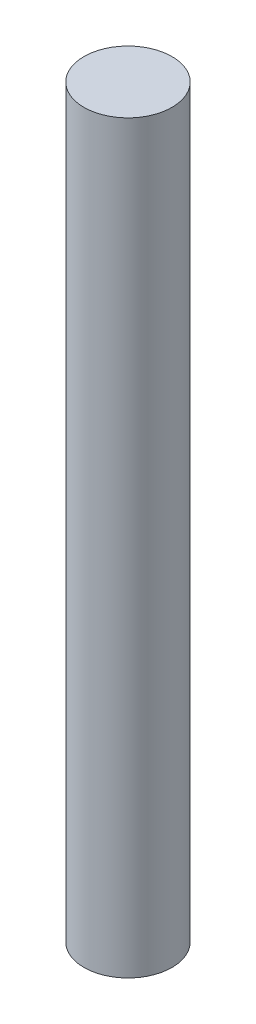
ISO-10303-21;
HEADER;
FILE_DESCRIPTION(('STEP AP214'),'2;1');
FILE_NAME('part.step','',(''),(''),'','','');
FILE_SCHEMA(('AUTOMOTIVE_DESIGN { 1 0 10303 214 1 1 1 1 }'));
ENDSEC;
DATA;
#1=APPLICATION_CONTEXT('core data for automotive mechanical design processes');
#2=APPLICATION_PROTOCOL_DEFINITION('international standard','automotive_design',2000,#1);
#3=PRODUCT_CONTEXT('',#1,'mechanical');
#4=PRODUCT('Part','Part','',(#3));
#5=PRODUCT_RELATED_PRODUCT_CATEGORY('part','',(#4));
#6=PRODUCT_DEFINITION_FORMATION('','',#4);
#7=PRODUCT_DEFINITION_CONTEXT('part definition',#1,'design');
#8=PRODUCT_DEFINITION('design','',#6,#7);
#9=PRODUCT_DEFINITION_SHAPE('','',#8);
#10=(LENGTH_UNIT() NAMED_UNIT(*) SI_UNIT(.MILLI.,.METRE.));
#11=(NAMED_UNIT(*) PLANE_ANGLE_UNIT() SI_UNIT($,.RADIAN.));
#12=(NAMED_UNIT(*) SI_UNIT($,.STERADIAN.) SOLID_ANGLE_UNIT());
#13=UNCERTAINTY_MEASURE_WITH_UNIT(LENGTH_MEASURE(1.E-05),#10,'distance_accuracy_value','');
#14=(GEOMETRIC_REPRESENTATION_CONTEXT(3) GLOBAL_UNCERTAINTY_ASSIGNED_CONTEXT((#13)) GLOBAL_UNIT_ASSIGNED_CONTEXT((#10,
#11,#12)) REPRESENTATION_CONTEXT('',''));
#15=CARTESIAN_POINT('',(0.,0.,0.));
#16=DIRECTION('',(0.,0.,1.));
#17=DIRECTION('',(1.,0.,0.));
#18=AXIS2_PLACEMENT_3D('',#15,#16,#17);
#19=CARTESIAN_POINT('',(-32.274944086,-23.599553766,-96.577253632));
#20=DIRECTION('',(0.,-1.,0.));
#21=DIRECTION('',(1.,0.,0.));
#22=AXIS2_PLACEMENT_3D('',#19,#20,#21);
#23=PLANE('',#22);
#24=CARTESIAN_POINT('',(-31.5001634156,-23.599553766,-95.8024729362));
#25=DIRECTION('',(0.,1.,0.));
#26=DIRECTION('',(0.,0.,1.));
#27=AXIS2_PLACEMENT_3D('',#24,#25,#26);
#28=CIRCLE('',#27,0.765593566599998);
#29=CARTESIAN_POINT('',(-31.5001634156,-23.599553766,-95.0368793696));
#30=VERTEX_POINT('',#29);
#31=EDGE_CURVE('E19',#30,#30,#28,.T.);
#32=ORIENTED_EDGE('',*,*,#31,.T.);
#33=EDGE_LOOP('',(#32));
#34=FACE_BOUND('',#33,.T.);
#35=ADVANCED_FACE('F15',(#34),#23,.F.);
#36=CARTESIAN_POINT('',(-32.274944086,-36.553553766,-96.577253632));
#37=DIRECTION('',(0.,-1.,0.));
#38=DIRECTION('',(1.,0.,0.));
#39=AXIS2_PLACEMENT_3D('',#36,#37,#38);
#40=PLANE('',#39);
#41=CARTESIAN_POINT('',(-31.5001634156,-36.553553766,-95.8024729362));
#42=DIRECTION('',(0.,1.,0.));
#43=DIRECTION('',(0.,0.,1.));
#44=AXIS2_PLACEMENT_3D('',#41,#42,#43);
#45=CIRCLE('',#44,0.765593566599998);
#46=CARTESIAN_POINT('',(-31.5001634156,-36.553553766,-95.0368793696));
#47=VERTEX_POINT('',#46);
#48=EDGE_CURVE('E10',#47,#47,#45,.F.);
#49=ORIENTED_EDGE('',*,*,#48,.T.);
#50=EDGE_LOOP('',(#49));
#51=FACE_BOUND('',#50,.T.);
#52=ADVANCED_FACE('F17',(#51),#40,.T.);
#53=CARTESIAN_POINT('',(-31.5001634156,-36.553553766,-95.8024729362));
#54=DIRECTION('',(0.,1.,0.));
#55=DIRECTION('',(0.,0.,1.));
#56=AXIS2_PLACEMENT_3D('',#53,#54,#55);
#57=CYLINDRICAL_SURFACE('',#56,0.765593566599998);
#58=ORIENTED_EDGE('',*,*,#31,.F.);
#59=EDGE_LOOP('',(#58));
#60=FACE_BOUND('',#59,.T.);
#61=ORIENTED_EDGE('',*,*,#48,.F.);
#62=EDGE_LOOP('',(#61));
#63=FACE_BOUND('',#62,.T.);
#64=ADVANCED_FACE('F29',(#60,#63),#57,.T.);
#65=CLOSED_SHELL('',(#35,#52,#64));
#66=MANIFOLD_SOLID_BREP('B1',#65);
#67=ADVANCED_BREP_SHAPE_REPRESENTATION('',(#18,#66),#14);
#68=SHAPE_DEFINITION_REPRESENTATION(#9,#67);
ENDSEC;
END-ISO-10303-21;
